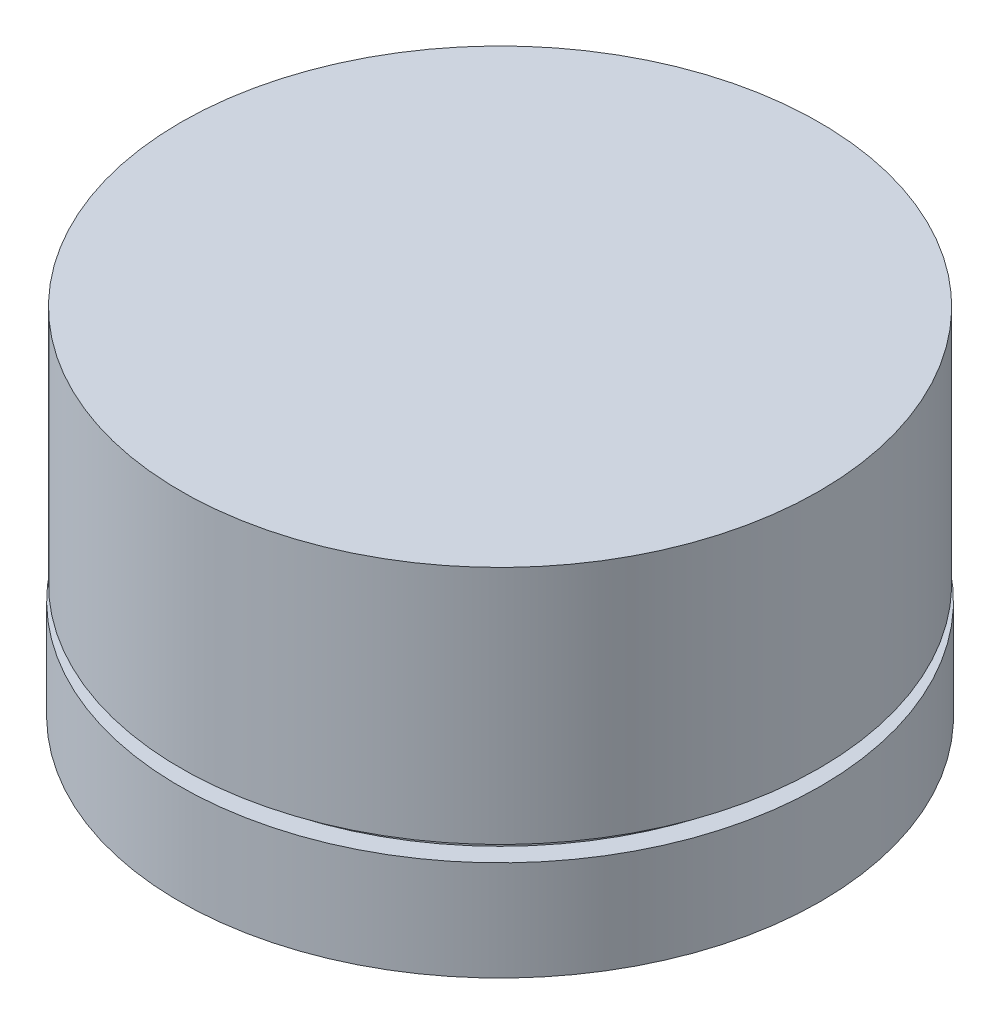
ISO-10303-21;
HEADER;
FILE_DESCRIPTION(('STEP AP214'),'2;1');
FILE_NAME('part.step','',(''),(''),'','','');
FILE_SCHEMA(('AUTOMOTIVE_DESIGN { 1 0 10303 214 1 1 1 1 }'));
ENDSEC;
DATA;
#1=APPLICATION_CONTEXT('core data for automotive mechanical design processes');
#2=APPLICATION_PROTOCOL_DEFINITION('international standard','automotive_design',2000,#1);
#3=PRODUCT_CONTEXT('',#1,'mechanical');
#4=PRODUCT('Part','Part','',(#3));
#5=PRODUCT_RELATED_PRODUCT_CATEGORY('part','',(#4));
#6=PRODUCT_DEFINITION_FORMATION('','',#4);
#7=PRODUCT_DEFINITION_CONTEXT('part definition',#1,'design');
#8=PRODUCT_DEFINITION('design','',#6,#7);
#9=PRODUCT_DEFINITION_SHAPE('','',#8);
#10=(LENGTH_UNIT() NAMED_UNIT(*) SI_UNIT(.MILLI.,.METRE.));
#11=(NAMED_UNIT(*) PLANE_ANGLE_UNIT() SI_UNIT($,.RADIAN.));
#12=(NAMED_UNIT(*) SI_UNIT($,.STERADIAN.) SOLID_ANGLE_UNIT());
#13=UNCERTAINTY_MEASURE_WITH_UNIT(LENGTH_MEASURE(1.E-05),#10,'distance_accuracy_value','');
#14=(GEOMETRIC_REPRESENTATION_CONTEXT(3) GLOBAL_UNCERTAINTY_ASSIGNED_CONTEXT((#13)) GLOBAL_UNIT_ASSIGNED_CONTEXT((#10,
#11,#12)) REPRESENTATION_CONTEXT('',''));
#15=CARTESIAN_POINT('',(0.,0.,0.));
#16=DIRECTION('',(0.,0.,1.));
#17=DIRECTION('',(1.,0.,0.));
#18=AXIS2_PLACEMENT_3D('',#15,#16,#17);
#19=CARTESIAN_POINT('',(0.,19.,0.));
#20=DIRECTION('',(0.,1.,0.));
#21=DIRECTION('',(-1.,0.,0.));
#22=AXIS2_PLACEMENT_3D('',#19,#20,#21);
#23=PLANE('',#22);
#24=CARTESIAN_POINT('',(0.,19.,0.));
#25=DIRECTION('',(0.,-1.,0.));
#26=DIRECTION('',(1.,0.,0.));
#27=AXIS2_PLACEMENT_3D('',#24,#25,#26);
#28=CIRCLE('',#27,16.);
#29=CARTESIAN_POINT('',(16.,19.,0.));
#30=VERTEX_POINT('',#29);
#31=EDGE_CURVE('E10',#30,#30,#28,.T.);
#32=ORIENTED_EDGE('',*,*,#31,.F.);
#33=EDGE_LOOP('',(#32));
#34=FACE_BOUND('',#33,.T.);
#35=ADVANCED_FACE('F37',(#34),#23,.T.);
#36=CARTESIAN_POINT('',(0.,0.,0.));
#37=DIRECTION('',(0.,-1.,0.));
#38=DIRECTION('',(1.,0.,0.));
#39=AXIS2_PLACEMENT_3D('',#36,#37,#38);
#40=CYLINDRICAL_SURFACE('',#39,16.);
#41=ORIENTED_EDGE('',*,*,#31,.T.);
#42=EDGE_LOOP('',(#41));
#43=FACE_BOUND('',#42,.T.);
#44=CARTESIAN_POINT('',(0.,6.97884950209196,0.));
#45=DIRECTION('',(0.,-1.,0.));
#46=DIRECTION('',(1.,0.,0.));
#47=AXIS2_PLACEMENT_3D('',#44,#45,#46);
#48=CIRCLE('',#47,16.);
#49=CARTESIAN_POINT('',(16.,6.97884950209196,0.));
#50=VERTEX_POINT('',#49);
#51=EDGE_CURVE('E44',#50,#50,#48,.T.);
#52=ORIENTED_EDGE('',*,*,#51,.F.);
#53=EDGE_LOOP('',(#52));
#54=FACE_BOUND('',#53,.T.);
#55=ADVANCED_FACE('F109',(#43,#54),#40,.T.);
#56=CARTESIAN_POINT('',(16.,6.97884950209196,0.));
#57=DIRECTION('',(0.,-1.,0.));
#58=DIRECTION('',(1.,0.,0.));
#59=AXIS2_PLACEMENT_3D('',#56,#57,#58);
#60=PLANE('',#59);
#61=ORIENTED_EDGE('',*,*,#51,.T.);
#62=EDGE_LOOP('',(#61));
#63=FACE_BOUND('',#62,.T.);
#64=CARTESIAN_POINT('',(0.,6.97884950209196,0.));
#65=DIRECTION('',(0.,-1.,0.));
#66=DIRECTION('',(1.,0.,0.));
#67=AXIS2_PLACEMENT_3D('',#64,#65,#66);
#68=CIRCLE('',#67,15.0501133201701);
#69=CARTESIAN_POINT('',(15.0501133201701,6.97884950209196,0.));
#70=VERTEX_POINT('',#69);
#71=EDGE_CURVE('E49',#70,#70,#68,.T.);
#72=ORIENTED_EDGE('',*,*,#71,.F.);
#73=EDGE_LOOP('',(#72));
#74=FACE_BOUND('',#73,.T.);
#75=ADVANCED_FACE('F114',(#63,#74),#60,.T.);
#76=CARTESIAN_POINT('',(0.,0.,0.));
#77=DIRECTION('',(0.,-1.,0.));
#78=DIRECTION('',(1.,0.,0.));
#79=AXIS2_PLACEMENT_3D('',#76,#77,#78);
#80=CYLINDRICAL_SURFACE('',#79,15.0501133201701);
#81=ORIENTED_EDGE('',*,*,#71,.T.);
#82=EDGE_LOOP('',(#81));
#83=FACE_BOUND('',#82,.T.);
#84=CARTESIAN_POINT('',(0.,6.22884950209196,0.));
#85=DIRECTION('',(0.,-1.,0.));
#86=DIRECTION('',(1.,0.,0.));
#87=AXIS2_PLACEMENT_3D('',#84,#85,#86);
#88=CIRCLE('',#87,15.0501133201701);
#89=CARTESIAN_POINT('',(15.0501133201701,6.22884950209196,0.));
#90=VERTEX_POINT('',#89);
#91=EDGE_CURVE('E54',#90,#90,#88,.T.);
#92=ORIENTED_EDGE('',*,*,#91,.F.);
#93=EDGE_LOOP('',(#92));
#94=FACE_BOUND('',#93,.T.);
#95=ADVANCED_FACE('F118',(#83,#94),#80,.T.);
#96=CARTESIAN_POINT('',(15.0501133201701,6.22884950209196,0.));
#97=DIRECTION('',(0.,1.,0.));
#98=DIRECTION('',(-1.,0.,0.));
#99=AXIS2_PLACEMENT_3D('',#96,#97,#98);
#100=PLANE('',#99);
#101=ORIENTED_EDGE('',*,*,#91,.T.);
#102=EDGE_LOOP('',(#101));
#103=FACE_BOUND('',#102,.T.);
#104=CARTESIAN_POINT('',(0.,6.22884950209196,0.));
#105=DIRECTION('',(0.,-1.,0.));
#106=DIRECTION('',(1.,0.,0.));
#107=AXIS2_PLACEMENT_3D('',#104,#105,#106);
#108=CIRCLE('',#107,16.0641366703051);
#109=CARTESIAN_POINT('',(16.0641366703051,6.22884950209196,0.));
#110=VERTEX_POINT('',#109);
#111=EDGE_CURVE('E60',#110,#110,#108,.T.);
#112=ORIENTED_EDGE('',*,*,#111,.F.);
#113=EDGE_LOOP('',(#112));
#114=FACE_BOUND('',#113,.T.);
#115=ADVANCED_FACE('F124',(#103,#114),#100,.T.);
#116=CARTESIAN_POINT('',(0.,0.,0.));
#117=DIRECTION('',(0.,-1.,0.));
#118=DIRECTION('',(1.,0.,0.));
#119=AXIS2_PLACEMENT_3D('',#116,#117,#118);
#120=CYLINDRICAL_SURFACE('',#119,16.0641366703051);
#121=ORIENTED_EDGE('',*,*,#111,.T.);
#122=EDGE_LOOP('',(#121));
#123=FACE_BOUND('',#122,.T.);
#124=CARTESIAN_POINT('',(0.,1.22884950209196,0.));
#125=DIRECTION('',(0.,-1.,0.));
#126=DIRECTION('',(1.,0.,0.));
#127=AXIS2_PLACEMENT_3D('',#124,#125,#126);
#128=CIRCLE('',#127,16.0641366703051);
#129=CARTESIAN_POINT('',(16.0641366703051,1.22884950209196,0.));
#130=VERTEX_POINT('',#129);
#131=EDGE_CURVE('E64',#130,#130,#128,.T.);
#132=ORIENTED_EDGE('',*,*,#131,.F.);
#133=EDGE_LOOP('',(#132));
#134=FACE_BOUND('',#133,.T.);
#135=ADVANCED_FACE('F128',(#123,#134),#120,.T.);
#136=CARTESIAN_POINT('',(16.0641366703051,1.22884950209196,0.));
#137=DIRECTION('',(0.,-1.,0.));
#138=DIRECTION('',(1.,0.,0.));
#139=AXIS2_PLACEMENT_3D('',#136,#137,#138);
#140=PLANE('',#139);
#141=ORIENTED_EDGE('',*,*,#131,.T.);
#142=EDGE_LOOP('',(#141));
#143=FACE_BOUND('',#142,.T.);
#144=CARTESIAN_POINT('',(0.,1.22884950209196,0.));
#145=DIRECTION('',(0.,-1.,0.));
#146=DIRECTION('',(1.,0.,0.));
#147=AXIS2_PLACEMENT_3D('',#144,#145,#146);
#148=CIRCLE('',#147,13.);
#149=CARTESIAN_POINT('',(13.,1.22884950209196,0.));
#150=VERTEX_POINT('',#149);
#151=EDGE_CURVE('E68',#150,#150,#148,.T.);
#152=ORIENTED_EDGE('',*,*,#151,.F.);
#153=EDGE_LOOP('',(#152));
#154=FACE_BOUND('',#153,.T.);
#155=ADVANCED_FACE('F132',(#143,#154),#140,.T.);
#156=CARTESIAN_POINT('',(0.,0.,0.));
#157=DIRECTION('',(0.,-1.,0.));
#158=DIRECTION('',(1.,0.,0.));
#159=AXIS2_PLACEMENT_3D('',#156,#157,#158);
#160=CYLINDRICAL_SURFACE('',#159,13.);
#161=ORIENTED_EDGE('',*,*,#151,.T.);
#162=EDGE_LOOP('',(#161));
#163=FACE_BOUND('',#162,.T.);
#164=CARTESIAN_POINT('',(0.,4.22884950209196,0.));
#165=DIRECTION('',(0.,-1.,0.));
#166=DIRECTION('',(1.,0.,0.));
#167=AXIS2_PLACEMENT_3D('',#164,#165,#166);
#168=CIRCLE('',#167,13.);
#169=CARTESIAN_POINT('',(13.,4.22884950209196,0.));
#170=VERTEX_POINT('',#169);
#171=EDGE_CURVE('E72',#170,#170,#168,.T.);
#172=ORIENTED_EDGE('',*,*,#171,.F.);
#173=EDGE_LOOP('',(#172));
#174=FACE_BOUND('',#173,.T.);
#175=ADVANCED_FACE('F136',(#163,#174),#160,.F.);
#176=CARTESIAN_POINT('',(13.,4.22884950209196,0.));
#177=DIRECTION('',(0.,1.,0.));
#178=DIRECTION('',(-1.,0.,0.));
#179=AXIS2_PLACEMENT_3D('',#176,#177,#178);
#180=PLANE('',#179);
#181=ORIENTED_EDGE('',*,*,#171,.T.);
#182=EDGE_LOOP('',(#181));
#183=FACE_BOUND('',#182,.T.);
#184=CARTESIAN_POINT('',(0.,4.22884950209196,0.));
#185=DIRECTION('',(0.,-1.,0.));
#186=DIRECTION('',(1.,0.,0.));
#187=AXIS2_PLACEMENT_3D('',#184,#185,#186);
#188=CIRCLE('',#187,14.5);
#189=CARTESIAN_POINT('',(14.5,4.22884950209196,0.));
#190=VERTEX_POINT('',#189);
#191=EDGE_CURVE('E76',#190,#190,#188,.T.);
#192=ORIENTED_EDGE('',*,*,#191,.F.);
#193=EDGE_LOOP('',(#192));
#194=FACE_BOUND('',#193,.T.);
#195=ADVANCED_FACE('F140',(#183,#194),#180,.T.);
#196=CARTESIAN_POINT('',(0.,0.,0.));
#197=DIRECTION('',(0.,-1.,0.));
#198=DIRECTION('',(1.,0.,0.));
#199=AXIS2_PLACEMENT_3D('',#196,#197,#198);
#200=CYLINDRICAL_SURFACE('',#199,14.5);
#201=ORIENTED_EDGE('',*,*,#191,.T.);
#202=EDGE_LOOP('',(#201));
#203=FACE_BOUND('',#202,.T.);
#204=CARTESIAN_POINT('',(0.,8.22884950209196,0.));
#205=DIRECTION('',(0.,-1.,0.));
#206=DIRECTION('',(1.,0.,0.));
#207=AXIS2_PLACEMENT_3D('',#204,#205,#206);
#208=CIRCLE('',#207,14.5);
#209=CARTESIAN_POINT('',(14.5,8.22884950209196,0.));
#210=VERTEX_POINT('',#209);
#211=EDGE_CURVE('E80',#210,#210,#208,.T.);
#212=ORIENTED_EDGE('',*,*,#211,.F.);
#213=EDGE_LOOP('',(#212));
#214=FACE_BOUND('',#213,.T.);
#215=ADVANCED_FACE('F105',(#203,#214),#200,.F.);
#216=CARTESIAN_POINT('',(14.5,8.22884950209196,0.));
#217=DIRECTION('',(0.,-1.,0.));
#218=DIRECTION('',(1.,0.,0.));
#219=AXIS2_PLACEMENT_3D('',#216,#217,#218);
#220=PLANE('',#219);
#221=ORIENTED_EDGE('',*,*,#211,.T.);
#222=EDGE_LOOP('',(#221));
#223=FACE_BOUND('',#222,.T.);
#224=CARTESIAN_POINT('',(0.,8.22884950209196,0.));
#225=DIRECTION('',(0.,-1.,0.));
#226=DIRECTION('',(1.,0.,0.));
#227=AXIS2_PLACEMENT_3D('',#224,#225,#226);
#228=CIRCLE('',#227,14.);
#229=CARTESIAN_POINT('',(14.,8.22884950209196,0.));
#230=VERTEX_POINT('',#229);
#231=EDGE_CURVE('E84',#230,#230,#228,.T.);
#232=ORIENTED_EDGE('',*,*,#231,.F.);
#233=EDGE_LOOP('',(#232));
#234=FACE_BOUND('',#233,.T.);
#235=ADVANCED_FACE('F97',(#223,#234),#220,.T.);
#236=CARTESIAN_POINT('',(0.,0.,0.));
#237=DIRECTION('',(0.,-1.,0.));
#238=DIRECTION('',(1.,0.,0.));
#239=AXIS2_PLACEMENT_3D('',#236,#237,#238);
#240=CYLINDRICAL_SURFACE('',#239,14.);
#241=ORIENTED_EDGE('',*,*,#231,.T.);
#242=EDGE_LOOP('',(#241));
#243=FACE_BOUND('',#242,.T.);
#244=CARTESIAN_POINT('',(0.,18.,0.));
#245=DIRECTION('',(0.,-1.,0.));
#246=DIRECTION('',(1.,0.,0.));
#247=AXIS2_PLACEMENT_3D('',#244,#245,#246);
#248=CIRCLE('',#247,14.);
#249=CARTESIAN_POINT('',(14.,18.,0.));
#250=VERTEX_POINT('',#249);
#251=EDGE_CURVE('E88',#250,#250,#248,.T.);
#252=ORIENTED_EDGE('',*,*,#251,.F.);
#253=EDGE_LOOP('',(#252));
#254=FACE_BOUND('',#253,.T.);
#255=ADVANCED_FACE('F95',(#243,#254),#240,.F.);
#256=CARTESIAN_POINT('',(14.,18.,0.));
#257=DIRECTION('',(0.,-1.,0.));
#258=DIRECTION('',(1.,0.,0.));
#259=AXIS2_PLACEMENT_3D('',#256,#257,#258);
#260=PLANE('',#259);
#261=ORIENTED_EDGE('',*,*,#251,.T.);
#262=EDGE_LOOP('',(#261));
#263=FACE_BOUND('',#262,.T.);
#264=ADVANCED_FACE('F93',(#263),#260,.T.);
#265=CLOSED_SHELL('',(#35,#55,#75,#95,#115,#135,#155,#175,#195,#215,#235,#255,#264));
#266=MANIFOLD_SOLID_BREP('B2',#265);
#267=ADVANCED_BREP_SHAPE_REPRESENTATION('',(#18,#266),#14);
#268=SHAPE_DEFINITION_REPRESENTATION(#9,#267);
ENDSEC;
END-ISO-10303-21;
